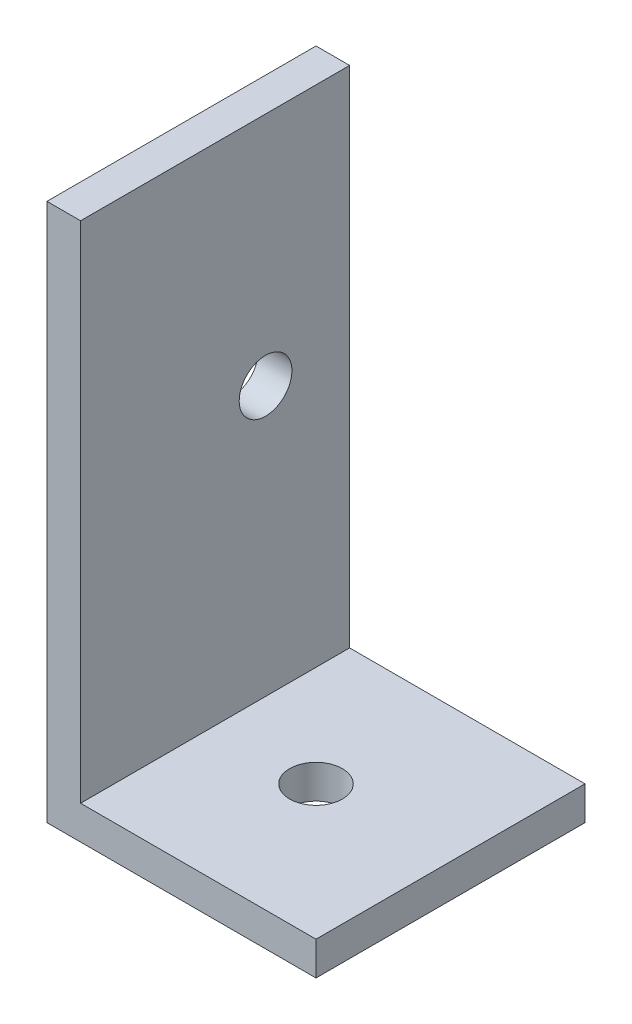
ISO-10303-21;
HEADER;
FILE_DESCRIPTION(('STEP AP214'),'2;1');
FILE_NAME('part.step','',(''),(''),'','','');
FILE_SCHEMA(('AUTOMOTIVE_DESIGN { 1 0 10303 214 1 1 1 1 }'));
ENDSEC;
DATA;
#1=APPLICATION_CONTEXT('core data for automotive mechanical design processes');
#2=APPLICATION_PROTOCOL_DEFINITION('international standard','automotive_design',2000,#1);
#3=PRODUCT_CONTEXT('',#1,'mechanical');
#4=PRODUCT('Part','Part','',(#3));
#5=PRODUCT_RELATED_PRODUCT_CATEGORY('part','',(#4));
#6=PRODUCT_DEFINITION_FORMATION('','',#4);
#7=PRODUCT_DEFINITION_CONTEXT('part definition',#1,'design');
#8=PRODUCT_DEFINITION('design','',#6,#7);
#9=PRODUCT_DEFINITION_SHAPE('','',#8);
#10=(LENGTH_UNIT() NAMED_UNIT(*) SI_UNIT(.MILLI.,.METRE.));
#11=(NAMED_UNIT(*) PLANE_ANGLE_UNIT() SI_UNIT($,.RADIAN.));
#12=(NAMED_UNIT(*) SI_UNIT($,.STERADIAN.) SOLID_ANGLE_UNIT());
#13=UNCERTAINTY_MEASURE_WITH_UNIT(LENGTH_MEASURE(1.E-05),#10,'distance_accuracy_value','');
#14=(GEOMETRIC_REPRESENTATION_CONTEXT(3) GLOBAL_UNCERTAINTY_ASSIGNED_CONTEXT((#13)) GLOBAL_UNIT_ASSIGNED_CONTEXT((#10,
#11,#12)) REPRESENTATION_CONTEXT('',''));
#15=CARTESIAN_POINT('',(0.,0.,0.));
#16=DIRECTION('',(0.,0.,1.));
#17=DIRECTION('',(1.,0.,0.));
#18=AXIS2_PLACEMENT_3D('',#15,#16,#17);
#19=CARTESIAN_POINT('',(25.4,0.,12.7));
#20=DIRECTION('',(0.,1.,0.));
#21=DIRECTION('',(-1.,0.,0.));
#22=AXIS2_PLACEMENT_3D('',#19,#20,#21);
#23=PLANE('',#22);
#24=CARTESIAN_POINT('',(12.7,0.,0.));
#25=DIRECTION('',(0.,1.,0.));
#26=DIRECTION('',(-1.,0.,0.));
#27=AXIS2_PLACEMENT_3D('',#24,#25,#26);
#28=CIRCLE('',#27,2.4892);
#29=CARTESIAN_POINT('',(10.2108,0.,0.));
#30=VERTEX_POINT('',#29);
#31=EDGE_CURVE('E139',#30,#30,#28,.T.);
#32=ORIENTED_EDGE('',*,*,#31,.T.);
#33=EDGE_LOOP('',(#32));
#34=FACE_BOUND('',#33,.T.);
#35=DIRECTION('',(1.,0.,0.));
#36=VECTOR('',#35,1.);
#37=CARTESIAN_POINT('',(25.4,0.,-12.7));
#38=LINE('',#37,#36);
#39=CARTESIAN_POINT('',(0.,0.,-12.7));
#40=VERTEX_POINT('',#39);
#41=CARTESIAN_POINT('',(25.4,0.,-12.7));
#42=VERTEX_POINT('',#41);
#43=EDGE_CURVE('E134',#40,#42,#38,.T.);
#44=ORIENTED_EDGE('',*,*,#43,.T.);
#45=DIRECTION('',(0.,0.,-1.));
#46=VECTOR('',#45,1.);
#47=CARTESIAN_POINT('',(25.4,0.,12.7));
#48=LINE('',#47,#46);
#49=CARTESIAN_POINT('',(25.4,0.,12.7));
#50=VERTEX_POINT('',#49);
#51=EDGE_CURVE('E11',#50,#42,#48,.T.);
#52=ORIENTED_EDGE('',*,*,#51,.F.);
#53=DIRECTION('',(1.,0.,0.));
#54=VECTOR('',#53,1.);
#55=CARTESIAN_POINT('',(25.4,0.,12.7));
#56=LINE('',#55,#54);
#57=CARTESIAN_POINT('',(0.,0.,12.7));
#58=VERTEX_POINT('',#57);
#59=EDGE_CURVE('E151',#58,#50,#56,.T.);
#60=ORIENTED_EDGE('',*,*,#59,.F.);
#61=DIRECTION('',(0.,0.,-1.));
#62=VECTOR('',#61,1.);
#63=CARTESIAN_POINT('',(0.,0.,12.7));
#64=LINE('',#63,#62);
#65=EDGE_CURVE('E130',#58,#40,#64,.T.);
#66=ORIENTED_EDGE('',*,*,#65,.T.);
#67=EDGE_LOOP('',(#44,#52,#60,#66));
#68=FACE_BOUND('',#67,.T.);
#69=ADVANCED_FACE('F45',(#34,#68),#23,.F.);
#70=CARTESIAN_POINT('',(25.4,3.175,12.7));
#71=DIRECTION('',(-1.,0.,0.));
#72=DIRECTION('',(0.,0.,1.));
#73=AXIS2_PLACEMENT_3D('',#70,#71,#72);
#74=PLANE('',#73);
#75=DIRECTION('',(0.,1.,0.));
#76=VECTOR('',#75,1.);
#77=CARTESIAN_POINT('',(25.4,3.175,-12.7));
#78=LINE('',#77,#76);
#79=CARTESIAN_POINT('',(25.4,3.175,-12.7));
#80=VERTEX_POINT('',#79);
#81=EDGE_CURVE('E138',#42,#80,#78,.T.);
#82=ORIENTED_EDGE('',*,*,#81,.T.);
#83=DIRECTION('',(0.,0.,-1.));
#84=VECTOR('',#83,1.);
#85=CARTESIAN_POINT('',(25.4,3.175,12.7));
#86=LINE('',#85,#84);
#87=CARTESIAN_POINT('',(25.4,3.175,12.7));
#88=VERTEX_POINT('',#87);
#89=EDGE_CURVE('E54',#88,#80,#86,.T.);
#90=ORIENTED_EDGE('',*,*,#89,.F.);
#91=DIRECTION('',(0.,1.,0.));
#92=VECTOR('',#91,1.);
#93=CARTESIAN_POINT('',(25.4,3.175,12.7));
#94=LINE('',#93,#92);
#95=EDGE_CURVE('E99',#50,#88,#94,.T.);
#96=ORIENTED_EDGE('',*,*,#95,.F.);
#97=ORIENTED_EDGE('',*,*,#51,.T.);
#98=EDGE_LOOP('',(#82,#90,#96,#97));
#99=FACE_BOUND('',#98,.T.);
#100=ADVANCED_FACE('F183',(#99),#74,.F.);
#101=CARTESIAN_POINT('',(3.175,3.175,12.7));
#102=DIRECTION('',(0.,-1.,0.));
#103=DIRECTION('',(1.,0.,0.));
#104=AXIS2_PLACEMENT_3D('',#101,#102,#103);
#105=PLANE('',#104);
#106=CARTESIAN_POINT('',(12.7,3.175,0.));
#107=DIRECTION('',(0.,1.,0.));
#108=DIRECTION('',(-1.,0.,0.));
#109=AXIS2_PLACEMENT_3D('',#106,#107,#108);
#110=CIRCLE('',#109,2.4892);
#111=CARTESIAN_POINT('',(10.2108,3.175,0.));
#112=VERTEX_POINT('',#111);
#113=EDGE_CURVE('E194',#112,#112,#110,.T.);
#114=ORIENTED_EDGE('',*,*,#113,.F.);
#115=EDGE_LOOP('',(#114));
#116=FACE_BOUND('',#115,.T.);
#117=DIRECTION('',(-1.,0.,0.));
#118=VECTOR('',#117,1.);
#119=CARTESIAN_POINT('',(3.175,3.175,-12.7));
#120=LINE('',#119,#118);
#121=CARTESIAN_POINT('',(3.175,3.175,-12.7));
#122=VERTEX_POINT('',#121);
#123=EDGE_CURVE('E142',#80,#122,#120,.T.);
#124=ORIENTED_EDGE('',*,*,#123,.T.);
#125=DIRECTION('',(0.,0.,-1.));
#126=VECTOR('',#125,1.);
#127=CARTESIAN_POINT('',(3.175,3.175,12.7));
#128=LINE('',#127,#126);
#129=CARTESIAN_POINT('',(3.175,3.175,12.7));
#130=VERTEX_POINT('',#129);
#131=EDGE_CURVE('E123',#130,#122,#128,.T.);
#132=ORIENTED_EDGE('',*,*,#131,.F.);
#133=DIRECTION('',(-1.,0.,0.));
#134=VECTOR('',#133,1.);
#135=CARTESIAN_POINT('',(3.175,3.175,12.7));
#136=LINE('',#135,#134);
#137=EDGE_CURVE('E112',#88,#130,#136,.T.);
#138=ORIENTED_EDGE('',*,*,#137,.F.);
#139=ORIENTED_EDGE('',*,*,#89,.T.);
#140=EDGE_LOOP('',(#124,#132,#138,#139));
#141=FACE_BOUND('',#140,.T.);
#142=ADVANCED_FACE('F161',(#116,#141),#105,.F.);
#143=CARTESIAN_POINT('',(3.175,50.8,12.7));
#144=DIRECTION('',(-1.,0.,0.));
#145=DIRECTION('',(0.,-1.,0.));
#146=AXIS2_PLACEMENT_3D('',#143,#144,#145);
#147=PLANE('',#146);
#148=CARTESIAN_POINT('',(3.175,28.575,-4.7625));
#149=DIRECTION('',(1.,0.,0.));
#150=DIRECTION('',(0.,1.,0.));
#151=AXIS2_PLACEMENT_3D('',#148,#149,#150);
#152=CIRCLE('',#151,2.4892);
#153=CARTESIAN_POINT('',(3.175,31.0642,-4.7625));
#154=VERTEX_POINT('',#153);
#155=EDGE_CURVE('E201',#154,#154,#152,.T.);
#156=ORIENTED_EDGE('',*,*,#155,.F.);
#157=EDGE_LOOP('',(#156));
#158=FACE_BOUND('',#157,.T.);
#159=DIRECTION('',(0.,1.,0.));
#160=VECTOR('',#159,1.);
#161=CARTESIAN_POINT('',(3.175,50.8,-12.7));
#162=LINE('',#161,#160);
#163=CARTESIAN_POINT('',(3.175,50.8,-12.7));
#164=VERTEX_POINT('',#163);
#165=EDGE_CURVE('E121',#122,#164,#162,.T.);
#166=ORIENTED_EDGE('',*,*,#165,.T.);
#167=DIRECTION('',(0.,0.,-1.));
#168=VECTOR('',#167,1.);
#169=CARTESIAN_POINT('',(3.175,50.8,12.7));
#170=LINE('',#169,#168);
#171=CARTESIAN_POINT('',(3.175,50.8,12.7));
#172=VERTEX_POINT('',#171);
#173=EDGE_CURVE('E118',#172,#164,#170,.T.);
#174=ORIENTED_EDGE('',*,*,#173,.F.);
#175=DIRECTION('',(0.,1.,0.));
#176=VECTOR('',#175,1.);
#177=CARTESIAN_POINT('',(3.175,50.8,12.7));
#178=LINE('',#177,#176);
#179=EDGE_CURVE('E106',#130,#172,#178,.T.);
#180=ORIENTED_EDGE('',*,*,#179,.F.);
#181=ORIENTED_EDGE('',*,*,#131,.T.);
#182=EDGE_LOOP('',(#166,#174,#180,#181));
#183=FACE_BOUND('',#182,.T.);
#184=ADVANCED_FACE('F119',(#158,#183),#147,.F.);
#185=CARTESIAN_POINT('',(0.,50.8,12.7));
#186=DIRECTION('',(0.,-1.,0.));
#187=DIRECTION('',(0.,0.,-1.));
#188=AXIS2_PLACEMENT_3D('',#185,#186,#187);
#189=PLANE('',#188);
#190=DIRECTION('',(-1.,0.,0.));
#191=VECTOR('',#190,1.);
#192=CARTESIAN_POINT('',(0.,50.8,-12.7));
#193=LINE('',#192,#191);
#194=CARTESIAN_POINT('',(0.,50.8,-12.7));
#195=VERTEX_POINT('',#194);
#196=EDGE_CURVE('E85',#164,#195,#193,.T.);
#197=ORIENTED_EDGE('',*,*,#196,.T.);
#198=DIRECTION('',(0.,0.,-1.));
#199=VECTOR('',#198,1.);
#200=CARTESIAN_POINT('',(0.,50.8,12.7));
#201=LINE('',#200,#199);
#202=CARTESIAN_POINT('',(0.,50.8,12.7));
#203=VERTEX_POINT('',#202);
#204=EDGE_CURVE('E124',#203,#195,#201,.T.);
#205=ORIENTED_EDGE('',*,*,#204,.F.);
#206=DIRECTION('',(-1.,0.,0.));
#207=VECTOR('',#206,1.);
#208=CARTESIAN_POINT('',(0.,50.8,12.7));
#209=LINE('',#208,#207);
#210=EDGE_CURVE('E110',#172,#203,#209,.T.);
#211=ORIENTED_EDGE('',*,*,#210,.F.);
#212=ORIENTED_EDGE('',*,*,#173,.T.);
#213=EDGE_LOOP('',(#197,#205,#211,#212));
#214=FACE_BOUND('',#213,.T.);
#215=ADVANCED_FACE('F126',(#214),#189,.F.);
#216=CARTESIAN_POINT('',(0.,0.,12.7));
#217=DIRECTION('',(1.,0.,0.));
#218=DIRECTION('',(0.,0.,-1.));
#219=AXIS2_PLACEMENT_3D('',#216,#217,#218);
#220=PLANE('',#219);
#221=CARTESIAN_POINT('',(0.,28.575,-4.7625));
#222=DIRECTION('',(1.,0.,0.));
#223=DIRECTION('',(0.,1.,0.));
#224=AXIS2_PLACEMENT_3D('',#221,#222,#223);
#225=CIRCLE('',#224,2.4892);
#226=CARTESIAN_POINT('',(0.,31.0642,-4.7625));
#227=VERTEX_POINT('',#226);
#228=EDGE_CURVE('E198',#227,#227,#225,.T.);
#229=ORIENTED_EDGE('',*,*,#228,.T.);
#230=EDGE_LOOP('',(#229));
#231=FACE_BOUND('',#230,.T.);
#232=DIRECTION('',(0.,-1.,0.));
#233=VECTOR('',#232,1.);
#234=CARTESIAN_POINT('',(0.,0.,-12.7));
#235=LINE('',#234,#233);
#236=EDGE_CURVE('E91',#195,#40,#235,.T.);
#237=ORIENTED_EDGE('',*,*,#236,.T.);
#238=ORIENTED_EDGE('',*,*,#65,.F.);
#239=DIRECTION('',(0.,-1.,0.));
#240=VECTOR('',#239,1.);
#241=CARTESIAN_POINT('',(0.,0.,12.7));
#242=LINE('',#241,#240);
#243=EDGE_CURVE('E62',#203,#58,#242,.T.);
#244=ORIENTED_EDGE('',*,*,#243,.F.);
#245=ORIENTED_EDGE('',*,*,#204,.T.);
#246=EDGE_LOOP('',(#237,#238,#244,#245));
#247=FACE_BOUND('',#246,.T.);
#248=ADVANCED_FACE('F168',(#231,#247),#220,.F.);
#249=CARTESIAN_POINT('',(0.,0.,12.7));
#250=DIRECTION('',(0.,0.,-1.));
#251=DIRECTION('',(-1.,0.,0.));
#252=AXIS2_PLACEMENT_3D('',#249,#250,#251);
#253=PLANE('',#252);
#254=ORIENTED_EDGE('',*,*,#59,.T.);
#255=ORIENTED_EDGE('',*,*,#95,.T.);
#256=ORIENTED_EDGE('',*,*,#137,.T.);
#257=ORIENTED_EDGE('',*,*,#179,.T.);
#258=ORIENTED_EDGE('',*,*,#210,.T.);
#259=ORIENTED_EDGE('',*,*,#243,.T.);
#260=EDGE_LOOP('',(#254,#255,#256,#257,#258,#259));
#261=FACE_BOUND('',#260,.T.);
#262=ADVANCED_FACE('F108',(#261),#253,.F.);
#263=CARTESIAN_POINT('',(0.,0.,-12.7));
#264=DIRECTION('',(0.,0.,-1.));
#265=DIRECTION('',(-1.,0.,0.));
#266=AXIS2_PLACEMENT_3D('',#263,#264,#265);
#267=PLANE('',#266);
#268=ORIENTED_EDGE('',*,*,#43,.F.);
#269=ORIENTED_EDGE('',*,*,#236,.F.);
#270=ORIENTED_EDGE('',*,*,#196,.F.);
#271=ORIENTED_EDGE('',*,*,#165,.F.);
#272=ORIENTED_EDGE('',*,*,#123,.F.);
#273=ORIENTED_EDGE('',*,*,#81,.F.);
#274=EDGE_LOOP('',(#268,#269,#270,#271,#272,#273));
#275=FACE_BOUND('',#274,.T.);
#276=ADVANCED_FACE('F164',(#275),#267,.T.);
#277=CARTESIAN_POINT('',(12.7,0.,0.));
#278=DIRECTION('',(0.,1.,0.));
#279=DIRECTION('',(-1.,0.,0.));
#280=AXIS2_PLACEMENT_3D('',#277,#278,#279);
#281=CYLINDRICAL_SURFACE('',#280,2.4892);
#282=ORIENTED_EDGE('',*,*,#31,.F.);
#283=EDGE_LOOP('',(#282));
#284=FACE_BOUND('',#283,.T.);
#285=ORIENTED_EDGE('',*,*,#113,.T.);
#286=EDGE_LOOP('',(#285));
#287=FACE_BOUND('',#286,.T.);
#288=ADVANCED_FACE('F215',(#284,#287),#281,.F.);
#289=CARTESIAN_POINT('',(0.,28.575,-4.7625));
#290=DIRECTION('',(1.,0.,0.));
#291=DIRECTION('',(0.,1.,0.));
#292=AXIS2_PLACEMENT_3D('',#289,#290,#291);
#293=CYLINDRICAL_SURFACE('',#292,2.4892);
#294=ORIENTED_EDGE('',*,*,#228,.F.);
#295=EDGE_LOOP('',(#294));
#296=FACE_BOUND('',#295,.T.);
#297=ORIENTED_EDGE('',*,*,#155,.T.);
#298=EDGE_LOOP('',(#297));
#299=FACE_BOUND('',#298,.T.);
#300=ADVANCED_FACE('F213',(#296,#299),#293,.F.);
#301=CLOSED_SHELL('',(#69,#100,#142,#184,#215,#248,#262,#276,#288,#300));
#302=MANIFOLD_SOLID_BREP('B2',#301);
#303=ADVANCED_BREP_SHAPE_REPRESENTATION('',(#18,#302),#14);
#304=SHAPE_DEFINITION_REPRESENTATION(#9,#303);
ENDSEC;
END-ISO-10303-21;
